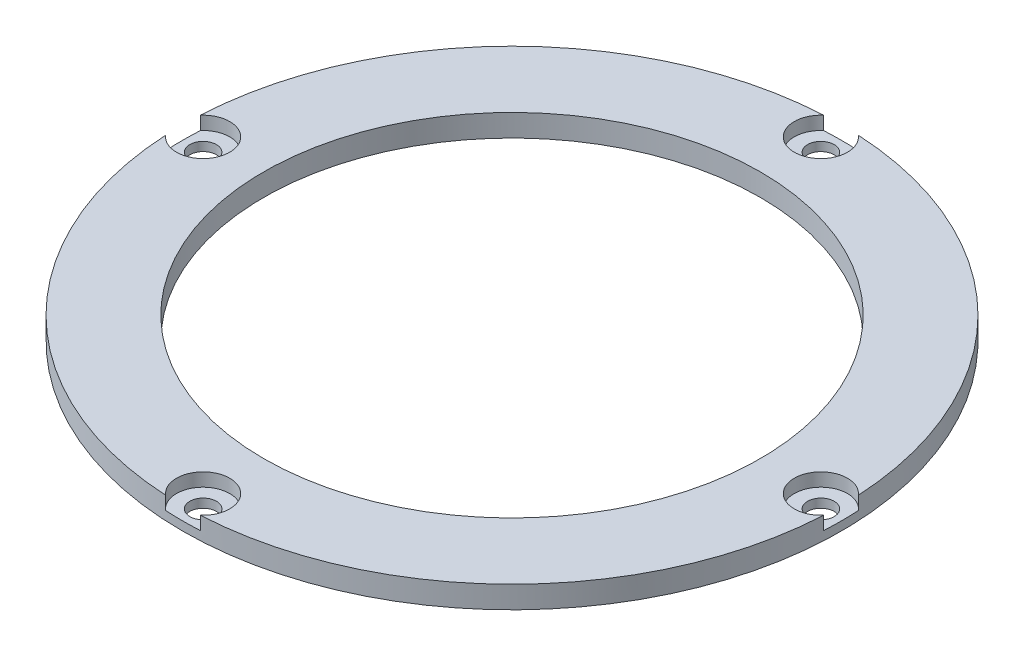
ISO-10303-21;
HEADER;
FILE_DESCRIPTION(('STEP AP214'),'2;1');
FILE_NAME('part.step','',(''),(''),'','','');
FILE_SCHEMA(('AUTOMOTIVE_DESIGN { 1 0 10303 214 1 1 1 1 }'));
ENDSEC;
DATA;
#1=APPLICATION_CONTEXT('core data for automotive mechanical design processes');
#2=APPLICATION_PROTOCOL_DEFINITION('international standard','automotive_design',2000,#1);
#3=PRODUCT_CONTEXT('',#1,'mechanical');
#4=PRODUCT('Part','Part','',(#3));
#5=PRODUCT_RELATED_PRODUCT_CATEGORY('part','',(#4));
#6=PRODUCT_DEFINITION_FORMATION('','',#4);
#7=PRODUCT_DEFINITION_CONTEXT('part definition',#1,'design');
#8=PRODUCT_DEFINITION('design','',#6,#7);
#9=PRODUCT_DEFINITION_SHAPE('','',#8);
#10=(LENGTH_UNIT() NAMED_UNIT(*) SI_UNIT(.MILLI.,.METRE.));
#11=(NAMED_UNIT(*) PLANE_ANGLE_UNIT() SI_UNIT($,.RADIAN.));
#12=(NAMED_UNIT(*) SI_UNIT($,.STERADIAN.) SOLID_ANGLE_UNIT());
#13=UNCERTAINTY_MEASURE_WITH_UNIT(LENGTH_MEASURE(1.E-05),#10,'distance_accuracy_value','');
#14=(GEOMETRIC_REPRESENTATION_CONTEXT(3) GLOBAL_UNCERTAINTY_ASSIGNED_CONTEXT((#13)) GLOBAL_UNIT_ASSIGNED_CONTEXT((#10,
#11,#12)) REPRESENTATION_CONTEXT('',''));
#15=CARTESIAN_POINT('',(0.,0.,0.));
#16=DIRECTION('',(0.,0.,1.));
#17=DIRECTION('',(1.,0.,0.));
#18=AXIS2_PLACEMENT_3D('',#15,#16,#17);
#19=CARTESIAN_POINT('',(0.,3.,0.));
#20=DIRECTION('',(0.,-1.,0.));
#21=DIRECTION('',(0.,0.,-1.));
#22=AXIS2_PLACEMENT_3D('',#19,#20,#21);
#23=CYLINDRICAL_SURFACE('',#22,37.15);
#24=CARTESIAN_POINT('',(0.,0.,0.));
#25=DIRECTION('',(0.,1.,0.));
#26=DIRECTION('',(0.,0.,1.));
#27=AXIS2_PLACEMENT_3D('',#24,#25,#26);
#28=CIRCLE('',#27,37.15);
#29=CARTESIAN_POINT('',(0.,0.,37.15));
#30=VERTEX_POINT('',#29);
#31=EDGE_CURVE('E221',#30,#30,#28,.T.);
#32=ORIENTED_EDGE('',*,*,#31,.T.);
#33=EDGE_LOOP('',(#32));
#34=FACE_BOUND('',#33,.T.);
#35=CARTESIAN_POINT('',(0.,2.5,0.));
#36=DIRECTION('',(0.,1.,0.));
#37=DIRECTION('',(0.,0.,1.));
#38=AXIS2_PLACEMENT_3D('',#35,#36,#37);
#39=CIRCLE('',#38,37.15);
#40=CARTESIAN_POINT('',(1.95746796578148,2.5,37.0983937544867));
#41=VERTEX_POINT('',#40);
#42=CARTESIAN_POINT('',(37.0983937544867,2.5,1.95746796578148));
#43=VERTEX_POINT('',#42);
#44=EDGE_CURVE('E105',#41,#43,#39,.T.);
#45=ORIENTED_EDGE('',*,*,#44,.F.);
#46=DIRECTION('',(0.,1.,0.));
#47=VECTOR('',#46,1.);
#48=CARTESIAN_POINT('',(1.9574679657815,2.,37.0983937544867));
#49=LINE('',#48,#47);
#50=CARTESIAN_POINT('',(1.95746796578151,1.,37.0983937544867));
#51=VERTEX_POINT('',#50);
#52=EDGE_CURVE('E120',#41,#51,#49,.F.);
#53=ORIENTED_EDGE('',*,*,#52,.T.);
#54=CARTESIAN_POINT('',(0.,1.,0.));
#55=DIRECTION('',(0.,1.,0.));
#56=DIRECTION('',(0.,0.,1.));
#57=AXIS2_PLACEMENT_3D('',#54,#55,#56);
#58=CIRCLE('',#57,37.15);
#59=CARTESIAN_POINT('',(-1.95746796578151,1.,37.0983937544867));
#60=VERTEX_POINT('',#59);
#61=EDGE_CURVE('E190',#60,#51,#58,.T.);
#62=ORIENTED_EDGE('',*,*,#61,.F.);
#63=DIRECTION('',(0.,1.,0.));
#64=VECTOR('',#63,1.);
#65=CARTESIAN_POINT('',(-1.9574679657815,2.,37.0983937544867));
#66=LINE('',#65,#64);
#67=CARTESIAN_POINT('',(-1.95746796578148,2.5,37.0983937544867));
#68=VERTEX_POINT('',#67);
#69=EDGE_CURVE('E131',#60,#68,#66,.T.);
#70=ORIENTED_EDGE('',*,*,#69,.T.);
#71=CARTESIAN_POINT('',(-37.0983937544867,2.5,1.95746796578148));
#72=VERTEX_POINT('',#71);
#73=EDGE_CURVE('E108',#72,#68,#39,.T.);
#74=ORIENTED_EDGE('',*,*,#73,.F.);
#75=DIRECTION('',(0.,1.,0.));
#76=VECTOR('',#75,1.);
#77=CARTESIAN_POINT('',(-37.0983937544867,2.,1.9574679657815));
#78=LINE('',#77,#76);
#79=CARTESIAN_POINT('',(-37.0983937544867,1.,1.95746796578151));
#80=VERTEX_POINT('',#79);
#81=EDGE_CURVE('E135',#72,#80,#78,.F.);
#82=ORIENTED_EDGE('',*,*,#81,.T.);
#83=CARTESIAN_POINT('',(0.,1.,0.));
#84=DIRECTION('',(0.,1.,0.));
#85=DIRECTION('',(0.,0.,1.));
#86=AXIS2_PLACEMENT_3D('',#83,#84,#85);
#87=CIRCLE('',#86,37.15);
#88=CARTESIAN_POINT('',(-37.0983937544867,1.,-1.95746796578151));
#89=VERTEX_POINT('',#88);
#90=EDGE_CURVE('E194',#89,#80,#87,.T.);
#91=ORIENTED_EDGE('',*,*,#90,.F.);
#92=DIRECTION('',(0.,1.,0.));
#93=VECTOR('',#92,1.);
#94=CARTESIAN_POINT('',(-37.0983937544867,2.,-1.9574679657815));
#95=LINE('',#94,#93);
#96=CARTESIAN_POINT('',(-37.0983937544867,2.5,-1.95746796578148));
#97=VERTEX_POINT('',#96);
#98=EDGE_CURVE('E143',#89,#97,#95,.T.);
#99=ORIENTED_EDGE('',*,*,#98,.T.);
#100=CARTESIAN_POINT('',(-1.95746796578148,2.5,-37.0983937544867));
#101=VERTEX_POINT('',#100);
#102=EDGE_CURVE('E158',#101,#97,#39,.T.);
#103=ORIENTED_EDGE('',*,*,#102,.F.);
#104=DIRECTION('',(0.,1.,0.));
#105=VECTOR('',#104,1.);
#106=CARTESIAN_POINT('',(-1.9574679657815,2.,-37.0983937544867));
#107=LINE('',#106,#105);
#108=CARTESIAN_POINT('',(-1.95746796578151,1.,-37.0983937544867));
#109=VERTEX_POINT('',#108);
#110=EDGE_CURVE('E147',#101,#109,#107,.F.);
#111=ORIENTED_EDGE('',*,*,#110,.T.);
#112=CARTESIAN_POINT('',(0.,1.,0.));
#113=DIRECTION('',(0.,1.,0.));
#114=DIRECTION('',(0.,0.,1.));
#115=AXIS2_PLACEMENT_3D('',#112,#113,#114);
#116=CIRCLE('',#115,37.15);
#117=CARTESIAN_POINT('',(1.95746796578151,1.,-37.0983937544867));
#118=VERTEX_POINT('',#117);
#119=EDGE_CURVE('E153',#118,#109,#116,.T.);
#120=ORIENTED_EDGE('',*,*,#119,.F.);
#121=DIRECTION('',(0.,1.,0.));
#122=VECTOR('',#121,1.);
#123=CARTESIAN_POINT('',(1.9574679657815,2.,-37.0983937544867));
#124=LINE('',#123,#122);
#125=CARTESIAN_POINT('',(1.9574679657815,2.5,-37.0983937544867));
#126=VERTEX_POINT('',#125);
#127=EDGE_CURVE('E47',#118,#126,#124,.T.);
#128=ORIENTED_EDGE('',*,*,#127,.T.);
#129=CARTESIAN_POINT('',(37.0983937544867,2.5,-1.95746796578148));
#130=VERTEX_POINT('',#129);
#131=EDGE_CURVE('E53',#130,#126,#39,.T.);
#132=ORIENTED_EDGE('',*,*,#131,.F.);
#133=DIRECTION('',(0.,1.,0.));
#134=VECTOR('',#133,1.);
#135=CARTESIAN_POINT('',(37.0983937544867,2.,-1.9574679657815));
#136=LINE('',#135,#134);
#137=CARTESIAN_POINT('',(37.0983937544867,1.,-1.95746796578151));
#138=VERTEX_POINT('',#137);
#139=EDGE_CURVE('E137',#130,#138,#136,.F.);
#140=ORIENTED_EDGE('',*,*,#139,.T.);
#141=CARTESIAN_POINT('',(0.,1.,0.));
#142=DIRECTION('',(0.,1.,0.));
#143=DIRECTION('',(0.,0.,1.));
#144=AXIS2_PLACEMENT_3D('',#141,#142,#143);
#145=CIRCLE('',#144,37.15);
#146=CARTESIAN_POINT('',(37.0983937544867,1.,1.95746796578151));
#147=VERTEX_POINT('',#146);
#148=EDGE_CURVE('E185',#147,#138,#145,.T.);
#149=ORIENTED_EDGE('',*,*,#148,.F.);
#150=DIRECTION('',(0.,1.,0.));
#151=VECTOR('',#150,1.);
#152=CARTESIAN_POINT('',(37.0983937544867,2.,1.9574679657815));
#153=LINE('',#152,#151);
#154=EDGE_CURVE('E124',#147,#43,#153,.T.);
#155=ORIENTED_EDGE('',*,*,#154,.T.);
#156=EDGE_LOOP('',(#45,#53,#62,#70,#74,#82,#91,#99,#103,#111,#120,#128,#132,#140,#149,#155));
#157=FACE_BOUND('',#156,.T.);
#158=ADVANCED_FACE('F39',(#34,#157),#23,.T.);
#159=CARTESIAN_POINT('',(0.,3.,0.));
#160=DIRECTION('',(0.,-1.,0.));
#161=DIRECTION('',(0.,0.,-1.));
#162=AXIS2_PLACEMENT_3D('',#159,#160,#161);
#163=CYLINDRICAL_SURFACE('',#162,28.);
#164=CARTESIAN_POINT('',(0.,0.,0.));
#165=DIRECTION('',(0.,1.,0.));
#166=DIRECTION('',(0.,0.,1.));
#167=AXIS2_PLACEMENT_3D('',#164,#165,#166);
#168=CIRCLE('',#167,28.);
#169=CARTESIAN_POINT('',(0.,0.,28.));
#170=VERTEX_POINT('',#169);
#171=EDGE_CURVE('E217',#170,#170,#168,.T.);
#172=ORIENTED_EDGE('',*,*,#171,.F.);
#173=EDGE_LOOP('',(#172));
#174=FACE_BOUND('',#173,.T.);
#175=CARTESIAN_POINT('',(0.,2.5,0.));
#176=DIRECTION('',(0.,1.,0.));
#177=DIRECTION('',(0.,0.,1.));
#178=AXIS2_PLACEMENT_3D('',#175,#176,#177);
#179=CIRCLE('',#178,28.);
#180=CARTESIAN_POINT('',(0.,2.5,28.));
#181=VERTEX_POINT('',#180);
#182=EDGE_CURVE('E170',#181,#181,#179,.T.);
#183=ORIENTED_EDGE('',*,*,#182,.T.);
#184=EDGE_LOOP('',(#183));
#185=FACE_BOUND('',#184,.T.);
#186=ADVANCED_FACE('F243',(#174,#185),#163,.F.);
#187=CARTESIAN_POINT('',(34.825,1.,0.));
#188=DIRECTION('',(0.,1.,0.));
#189=DIRECTION('',(0.,0.,1.));
#190=AXIS2_PLACEMENT_3D('',#187,#188,#189);
#191=CYLINDRICAL_SURFACE('',#190,3.);
#192=CARTESIAN_POINT('',(34.825,2.5,0.));
#193=DIRECTION('',(0.,1.,0.));
#194=DIRECTION('',(0.,0.,1.));
#195=AXIS2_PLACEMENT_3D('',#192,#193,#194);
#196=CIRCLE('',#195,3.);
#197=EDGE_CURVE('E114',#43,#130,#196,.F.);
#198=ORIENTED_EDGE('',*,*,#197,.F.);
#199=ORIENTED_EDGE('',*,*,#154,.F.);
#200=CARTESIAN_POINT('',(34.825,1.,0.));
#201=DIRECTION('',(0.,1.,0.));
#202=DIRECTION('',(0.,0.,1.));
#203=AXIS2_PLACEMENT_3D('',#200,#201,#202);
#204=CIRCLE('',#203,3.);
#205=EDGE_CURVE('E174',#138,#147,#204,.T.);
#206=ORIENTED_EDGE('',*,*,#205,.F.);
#207=ORIENTED_EDGE('',*,*,#139,.F.);
#208=EDGE_LOOP('',(#198,#199,#206,#207));
#209=FACE_BOUND('',#208,.T.);
#210=ADVANCED_FACE('F241',(#209),#191,.F.);
#211=CARTESIAN_POINT('',(0.,1.,34.825));
#212=DIRECTION('',(0.,1.,0.));
#213=DIRECTION('',(0.,0.,1.));
#214=AXIS2_PLACEMENT_3D('',#211,#212,#213);
#215=CYLINDRICAL_SURFACE('',#214,3.);
#216=CARTESIAN_POINT('',(0.,2.5,34.825));
#217=DIRECTION('',(0.,1.,0.));
#218=DIRECTION('',(0.,0.,1.));
#219=AXIS2_PLACEMENT_3D('',#216,#217,#218);
#220=CIRCLE('',#219,3.);
#221=EDGE_CURVE('E102',#68,#41,#220,.F.);
#222=ORIENTED_EDGE('',*,*,#221,.F.);
#223=ORIENTED_EDGE('',*,*,#69,.F.);
#224=CARTESIAN_POINT('',(0.,1.,34.825));
#225=DIRECTION('',(0.,1.,0.));
#226=DIRECTION('',(0.,0.,1.));
#227=AXIS2_PLACEMENT_3D('',#224,#225,#226);
#228=CIRCLE('',#227,3.);
#229=EDGE_CURVE('E129',#51,#60,#228,.T.);
#230=ORIENTED_EDGE('',*,*,#229,.F.);
#231=ORIENTED_EDGE('',*,*,#52,.F.);
#232=EDGE_LOOP('',(#222,#223,#230,#231));
#233=FACE_BOUND('',#232,.T.);
#234=ADVANCED_FACE('F128',(#233),#215,.F.);
#235=CARTESIAN_POINT('',(-34.825,1.,0.));
#236=DIRECTION('',(0.,1.,0.));
#237=DIRECTION('',(0.,0.,1.));
#238=AXIS2_PLACEMENT_3D('',#235,#236,#237);
#239=CYLINDRICAL_SURFACE('',#238,3.);
#240=CARTESIAN_POINT('',(-34.825,2.5,0.));
#241=DIRECTION('',(0.,1.,0.));
#242=DIRECTION('',(0.,0.,1.));
#243=AXIS2_PLACEMENT_3D('',#240,#241,#242);
#244=CIRCLE('',#243,3.);
#245=EDGE_CURVE('E115',#97,#72,#244,.F.);
#246=ORIENTED_EDGE('',*,*,#245,.F.);
#247=ORIENTED_EDGE('',*,*,#98,.F.);
#248=CARTESIAN_POINT('',(-34.825,1.,0.));
#249=DIRECTION('',(0.,1.,0.));
#250=DIRECTION('',(0.,0.,1.));
#251=AXIS2_PLACEMENT_3D('',#248,#249,#250);
#252=CIRCLE('',#251,3.);
#253=EDGE_CURVE('E178',#80,#89,#252,.T.);
#254=ORIENTED_EDGE('',*,*,#253,.F.);
#255=ORIENTED_EDGE('',*,*,#81,.F.);
#256=EDGE_LOOP('',(#246,#247,#254,#255));
#257=FACE_BOUND('',#256,.T.);
#258=ADVANCED_FACE('F249',(#257),#239,.F.);
#259=CARTESIAN_POINT('',(0.,1.,-34.825));
#260=DIRECTION('',(0.,1.,0.));
#261=DIRECTION('',(0.,0.,1.));
#262=AXIS2_PLACEMENT_3D('',#259,#260,#261);
#263=CYLINDRICAL_SURFACE('',#262,3.);
#264=CARTESIAN_POINT('',(0.,2.5,-34.825));
#265=DIRECTION('',(0.,1.,0.));
#266=DIRECTION('',(0.,0.,1.));
#267=AXIS2_PLACEMENT_3D('',#264,#265,#266);
#268=CIRCLE('',#267,3.);
#269=EDGE_CURVE('E11',#126,#101,#268,.F.);
#270=ORIENTED_EDGE('',*,*,#269,.F.);
#271=ORIENTED_EDGE('',*,*,#127,.F.);
#272=CARTESIAN_POINT('',(0.,1.,-34.825));
#273=DIRECTION('',(0.,1.,0.));
#274=DIRECTION('',(0.,0.,1.));
#275=AXIS2_PLACEMENT_3D('',#272,#273,#274);
#276=CIRCLE('',#275,3.);
#277=EDGE_CURVE('E60',#109,#118,#276,.T.);
#278=ORIENTED_EDGE('',*,*,#277,.F.);
#279=ORIENTED_EDGE('',*,*,#110,.F.);
#280=EDGE_LOOP('',(#270,#271,#278,#279));
#281=FACE_BOUND('',#280,.T.);
#282=ADVANCED_FACE('F155',(#281),#263,.F.);
#283=CARTESIAN_POINT('',(0.,3.,-34.825));
#284=DIRECTION('',(0.,-1.,0.));
#285=DIRECTION('',(0.,0.,-1.));
#286=AXIS2_PLACEMENT_3D('',#283,#284,#285);
#287=CYLINDRICAL_SURFACE('',#286,1.5);
#288=CARTESIAN_POINT('',(0.,0.,-34.825));
#289=DIRECTION('',(0.,1.,0.));
#290=DIRECTION('',(0.,0.,1.));
#291=AXIS2_PLACEMENT_3D('',#288,#289,#290);
#292=CIRCLE('',#291,1.5);
#293=CARTESIAN_POINT('',(0.,0.,-33.325));
#294=VERTEX_POINT('',#293);
#295=EDGE_CURVE('E213',#294,#294,#292,.T.);
#296=ORIENTED_EDGE('',*,*,#295,.F.);
#297=EDGE_LOOP('',(#296));
#298=FACE_BOUND('',#297,.T.);
#299=CARTESIAN_POINT('',(0.,1.,-34.825));
#300=DIRECTION('',(0.,1.,0.));
#301=DIRECTION('',(0.,0.,1.));
#302=AXIS2_PLACEMENT_3D('',#299,#300,#301);
#303=CIRCLE('',#302,1.5);
#304=CARTESIAN_POINT('',(0.,1.,-33.325));
#305=VERTEX_POINT('',#304);
#306=EDGE_CURVE('E198',#305,#305,#303,.T.);
#307=ORIENTED_EDGE('',*,*,#306,.T.);
#308=EDGE_LOOP('',(#307));
#309=FACE_BOUND('',#308,.T.);
#310=ADVANCED_FACE('F298',(#298,#309),#287,.F.);
#311=CARTESIAN_POINT('',(-34.825,3.,0.));
#312=DIRECTION('',(0.,-1.,0.));
#313=DIRECTION('',(0.,0.,-1.));
#314=AXIS2_PLACEMENT_3D('',#311,#312,#313);
#315=CYLINDRICAL_SURFACE('',#314,1.5);
#316=CARTESIAN_POINT('',(-34.825,0.,0.));
#317=DIRECTION('',(0.,1.,0.));
#318=DIRECTION('',(0.,0.,1.));
#319=AXIS2_PLACEMENT_3D('',#316,#317,#318);
#320=CIRCLE('',#319,1.5);
#321=CARTESIAN_POINT('',(-34.825,0.,1.5));
#322=VERTEX_POINT('',#321);
#323=EDGE_CURVE('E209',#322,#322,#320,.T.);
#324=ORIENTED_EDGE('',*,*,#323,.F.);
#325=EDGE_LOOP('',(#324));
#326=FACE_BOUND('',#325,.T.);
#327=CARTESIAN_POINT('',(-34.825,1.,0.));
#328=DIRECTION('',(0.,1.,0.));
#329=DIRECTION('',(0.,0.,1.));
#330=AXIS2_PLACEMENT_3D('',#327,#328,#329);
#331=CIRCLE('',#330,1.5);
#332=CARTESIAN_POINT('',(-34.825,1.,1.5));
#333=VERTEX_POINT('',#332);
#334=EDGE_CURVE('E193',#333,#333,#331,.T.);
#335=ORIENTED_EDGE('',*,*,#334,.T.);
#336=EDGE_LOOP('',(#335));
#337=FACE_BOUND('',#336,.T.);
#338=ADVANCED_FACE('F342',(#326,#337),#315,.F.);
#339=CARTESIAN_POINT('',(0.,3.,34.825));
#340=DIRECTION('',(0.,-1.,0.));
#341=DIRECTION('',(0.,0.,-1.));
#342=AXIS2_PLACEMENT_3D('',#339,#340,#341);
#343=CYLINDRICAL_SURFACE('',#342,1.5);
#344=CARTESIAN_POINT('',(0.,0.,34.825));
#345=DIRECTION('',(0.,1.,0.));
#346=DIRECTION('',(0.,0.,1.));
#347=AXIS2_PLACEMENT_3D('',#344,#345,#346);
#348=CIRCLE('',#347,1.5);
#349=CARTESIAN_POINT('',(0.,0.,36.325));
#350=VERTEX_POINT('',#349);
#351=EDGE_CURVE('E205',#350,#350,#348,.T.);
#352=ORIENTED_EDGE('',*,*,#351,.F.);
#353=EDGE_LOOP('',(#352));
#354=FACE_BOUND('',#353,.T.);
#355=CARTESIAN_POINT('',(0.,1.,34.825));
#356=DIRECTION('',(0.,1.,0.));
#357=DIRECTION('',(0.,0.,1.));
#358=AXIS2_PLACEMENT_3D('',#355,#356,#357);
#359=CIRCLE('',#358,1.5);
#360=CARTESIAN_POINT('',(0.,1.,36.325));
#361=VERTEX_POINT('',#360);
#362=EDGE_CURVE('E189',#361,#361,#359,.T.);
#363=ORIENTED_EDGE('',*,*,#362,.T.);
#364=EDGE_LOOP('',(#363));
#365=FACE_BOUND('',#364,.T.);
#366=ADVANCED_FACE('F277',(#354,#365),#343,.F.);
#367=CARTESIAN_POINT('',(34.825,3.,0.));
#368=DIRECTION('',(0.,-1.,0.));
#369=DIRECTION('',(0.,0.,-1.));
#370=AXIS2_PLACEMENT_3D('',#367,#368,#369);
#371=CYLINDRICAL_SURFACE('',#370,1.5);
#372=CARTESIAN_POINT('',(34.825,0.,0.));
#373=DIRECTION('',(0.,1.,0.));
#374=DIRECTION('',(0.,0.,1.));
#375=AXIS2_PLACEMENT_3D('',#372,#373,#374);
#376=CIRCLE('',#375,1.5);
#377=CARTESIAN_POINT('',(34.825,0.,1.5));
#378=VERTEX_POINT('',#377);
#379=EDGE_CURVE('E201',#378,#378,#376,.T.);
#380=ORIENTED_EDGE('',*,*,#379,.F.);
#381=EDGE_LOOP('',(#380));
#382=FACE_BOUND('',#381,.T.);
#383=CARTESIAN_POINT('',(34.825,1.,0.));
#384=DIRECTION('',(0.,1.,0.));
#385=DIRECTION('',(0.,0.,1.));
#386=AXIS2_PLACEMENT_3D('',#383,#384,#385);
#387=CIRCLE('',#386,1.5);
#388=CARTESIAN_POINT('',(34.825,1.,1.5));
#389=VERTEX_POINT('',#388);
#390=EDGE_CURVE('E177',#389,#389,#387,.T.);
#391=ORIENTED_EDGE('',*,*,#390,.T.);
#392=EDGE_LOOP('',(#391));
#393=FACE_BOUND('',#392,.T.);
#394=ADVANCED_FACE('F264',(#382,#393),#371,.F.);
#395=CARTESIAN_POINT('',(0.,0.,0.));
#396=DIRECTION('',(0.,1.,0.));
#397=DIRECTION('',(0.,0.,1.));
#398=AXIS2_PLACEMENT_3D('',#395,#396,#397);
#399=PLANE('',#398);
#400=ORIENTED_EDGE('',*,*,#31,.F.);
#401=EDGE_LOOP('',(#400));
#402=FACE_BOUND('',#401,.T.);
#403=ORIENTED_EDGE('',*,*,#171,.T.);
#404=EDGE_LOOP('',(#403));
#405=FACE_BOUND('',#404,.T.);
#406=ORIENTED_EDGE('',*,*,#295,.T.);
#407=EDGE_LOOP('',(#406));
#408=FACE_BOUND('',#407,.T.);
#409=ORIENTED_EDGE('',*,*,#323,.T.);
#410=EDGE_LOOP('',(#409));
#411=FACE_BOUND('',#410,.T.);
#412=ORIENTED_EDGE('',*,*,#351,.T.);
#413=EDGE_LOOP('',(#412));
#414=FACE_BOUND('',#413,.T.);
#415=ORIENTED_EDGE('',*,*,#379,.T.);
#416=EDGE_LOOP('',(#415));
#417=FACE_BOUND('',#416,.T.);
#418=ADVANCED_FACE('F261',(#402,#405,#408,#411,#414,#417),#399,.F.);
#419=CARTESIAN_POINT('',(34.825,1.,0.));
#420=DIRECTION('',(0.,1.,0.));
#421=DIRECTION('',(0.,0.,1.));
#422=AXIS2_PLACEMENT_3D('',#419,#420,#421);
#423=PLANE('',#422);
#424=ORIENTED_EDGE('',*,*,#390,.F.);
#425=EDGE_LOOP('',(#424));
#426=FACE_BOUND('',#425,.T.);
#427=ORIENTED_EDGE('',*,*,#148,.T.);
#428=ORIENTED_EDGE('',*,*,#205,.T.);
#429=EDGE_LOOP('',(#427,#428));
#430=FACE_BOUND('',#429,.T.);
#431=ADVANCED_FACE('F240',(#426,#430),#423,.T.);
#432=CARTESIAN_POINT('',(0.,1.,34.825));
#433=DIRECTION('',(0.,1.,0.));
#434=DIRECTION('',(0.,0.,1.));
#435=AXIS2_PLACEMENT_3D('',#432,#433,#434);
#436=PLANE('',#435);
#437=ORIENTED_EDGE('',*,*,#362,.F.);
#438=EDGE_LOOP('',(#437));
#439=FACE_BOUND('',#438,.T.);
#440=ORIENTED_EDGE('',*,*,#61,.T.);
#441=ORIENTED_EDGE('',*,*,#229,.T.);
#442=EDGE_LOOP('',(#440,#441));
#443=FACE_BOUND('',#442,.T.);
#444=ADVANCED_FACE('F281',(#439,#443),#436,.T.);
#445=CARTESIAN_POINT('',(-34.825,1.,0.));
#446=DIRECTION('',(0.,1.,0.));
#447=DIRECTION('',(0.,0.,1.));
#448=AXIS2_PLACEMENT_3D('',#445,#446,#447);
#449=PLANE('',#448);
#450=ORIENTED_EDGE('',*,*,#334,.F.);
#451=EDGE_LOOP('',(#450));
#452=FACE_BOUND('',#451,.T.);
#453=ORIENTED_EDGE('',*,*,#90,.T.);
#454=ORIENTED_EDGE('',*,*,#253,.T.);
#455=EDGE_LOOP('',(#453,#454));
#456=FACE_BOUND('',#455,.T.);
#457=ADVANCED_FACE('F285',(#452,#456),#449,.T.);
#458=CARTESIAN_POINT('',(0.,1.,-34.825));
#459=DIRECTION('',(0.,1.,0.));
#460=DIRECTION('',(0.,0.,1.));
#461=AXIS2_PLACEMENT_3D('',#458,#459,#460);
#462=PLANE('',#461);
#463=ORIENTED_EDGE('',*,*,#306,.F.);
#464=EDGE_LOOP('',(#463));
#465=FACE_BOUND('',#464,.T.);
#466=ORIENTED_EDGE('',*,*,#119,.T.);
#467=ORIENTED_EDGE('',*,*,#277,.T.);
#468=EDGE_LOOP('',(#466,#467));
#469=FACE_BOUND('',#468,.T.);
#470=ADVANCED_FACE('F294',(#465,#469),#462,.T.);
#471=CARTESIAN_POINT('',(0.,2.5,0.));
#472=DIRECTION('',(0.,1.,0.));
#473=DIRECTION('',(0.,0.,1.));
#474=AXIS2_PLACEMENT_3D('',#471,#472,#473);
#475=PLANE('',#474);
#476=ORIENTED_EDGE('',*,*,#182,.F.);
#477=EDGE_LOOP('',(#476));
#478=FACE_BOUND('',#477,.T.);
#479=ORIENTED_EDGE('',*,*,#197,.T.);
#480=ORIENTED_EDGE('',*,*,#131,.T.);
#481=ORIENTED_EDGE('',*,*,#269,.T.);
#482=ORIENTED_EDGE('',*,*,#102,.T.);
#483=ORIENTED_EDGE('',*,*,#245,.T.);
#484=ORIENTED_EDGE('',*,*,#73,.T.);
#485=ORIENTED_EDGE('',*,*,#221,.T.);
#486=ORIENTED_EDGE('',*,*,#44,.T.);
#487=EDGE_LOOP('',(#479,#480,#481,#482,#483,#484,#485,#486));
#488=FACE_BOUND('',#487,.T.);
#489=ADVANCED_FACE('F104',(#478,#488),#475,.T.);
#490=CLOSED_SHELL('',(#158,#186,#210,#234,#258,#282,#310,#338,#366,#394,#418,#431,#444,#457,
#470,#489));
#491=MANIFOLD_SOLID_BREP('B2',#490);
#492=ADVANCED_BREP_SHAPE_REPRESENTATION('',(#18,#491),#14);
#493=SHAPE_DEFINITION_REPRESENTATION(#9,#492);
ENDSEC;
END-ISO-10303-21;
